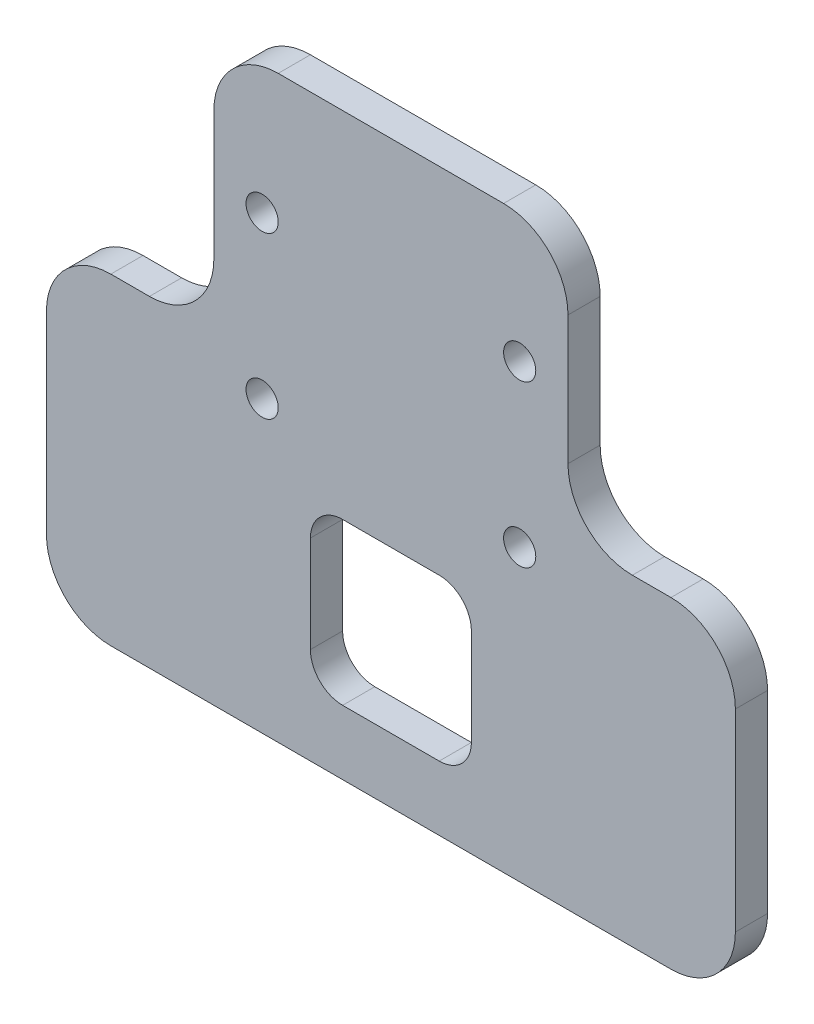
ISO-10303-21;
HEADER;
FILE_DESCRIPTION(('STEP AP214'),'2;1');
FILE_NAME('part.step','',(''),(''),'','','');
FILE_SCHEMA(('AUTOMOTIVE_DESIGN { 1 0 10303 214 1 1 1 1 }'));
ENDSEC;
DATA;
#1=APPLICATION_CONTEXT('core data for automotive mechanical design processes');
#2=APPLICATION_PROTOCOL_DEFINITION('international standard','automotive_design',2000,#1);
#3=PRODUCT_CONTEXT('',#1,'mechanical');
#4=PRODUCT('Part','Part','',(#3));
#5=PRODUCT_RELATED_PRODUCT_CATEGORY('part','',(#4));
#6=PRODUCT_DEFINITION_FORMATION('','',#4);
#7=PRODUCT_DEFINITION_CONTEXT('part definition',#1,'design');
#8=PRODUCT_DEFINITION('design','',#6,#7);
#9=PRODUCT_DEFINITION_SHAPE('','',#8);
#10=(LENGTH_UNIT() NAMED_UNIT(*) SI_UNIT(.MILLI.,.METRE.));
#11=(NAMED_UNIT(*) PLANE_ANGLE_UNIT() SI_UNIT($,.RADIAN.));
#12=(NAMED_UNIT(*) SI_UNIT($,.STERADIAN.) SOLID_ANGLE_UNIT());
#13=UNCERTAINTY_MEASURE_WITH_UNIT(LENGTH_MEASURE(1.E-05),#10,'distance_accuracy_value','');
#14=(GEOMETRIC_REPRESENTATION_CONTEXT(3) GLOBAL_UNCERTAINTY_ASSIGNED_CONTEXT((#13)) GLOBAL_UNIT_ASSIGNED_CONTEXT((#10,
#11,#12)) REPRESENTATION_CONTEXT('',''));
#15=CARTESIAN_POINT('',(0.,0.,0.));
#16=DIRECTION('',(0.,0.,1.));
#17=DIRECTION('',(1.,0.,0.));
#18=AXIS2_PLACEMENT_3D('',#15,#16,#17);
#19=CARTESIAN_POINT('',(20.,45.,5.));
#20=DIRECTION('',(0.,0.,-1.));
#21=DIRECTION('',(-1.,0.,0.));
#22=AXIS2_PLACEMENT_3D('',#19,#20,#21);
#23=CYLINDRICAL_SURFACE('',#22,2.5);
#24=CARTESIAN_POINT('',(20.,45.,5.));
#25=DIRECTION('',(0.,0.,1.));
#26=DIRECTION('',(1.,0.,0.));
#27=AXIS2_PLACEMENT_3D('',#24,#25,#26);
#28=CIRCLE('',#27,2.5);
#29=CARTESIAN_POINT('',(22.5,45.,5.));
#30=VERTEX_POINT('',#29);
#31=EDGE_CURVE('E345',#30,#30,#28,.F.);
#32=ORIENTED_EDGE('',*,*,#31,.F.);
#33=EDGE_LOOP('',(#32));
#34=FACE_BOUND('',#33,.T.);
#35=CARTESIAN_POINT('',(20.,45.,0.));
#36=DIRECTION('',(0.,0.,1.));
#37=DIRECTION('',(1.,0.,0.));
#38=AXIS2_PLACEMENT_3D('',#35,#36,#37);
#39=CIRCLE('',#38,2.5);
#40=CARTESIAN_POINT('',(22.5,45.,0.));
#41=VERTEX_POINT('',#40);
#42=EDGE_CURVE('E339',#41,#41,#39,.F.);
#43=ORIENTED_EDGE('',*,*,#42,.T.);
#44=EDGE_LOOP('',(#43));
#45=FACE_BOUND('',#44,.T.);
#46=ADVANCED_FACE('F95',(#34,#45),#23,.F.);
#47=CARTESIAN_POINT('',(0.,-15.,5.));
#48=DIRECTION('',(0.,1.,0.));
#49=DIRECTION('',(0.,0.,1.));
#50=AXIS2_PLACEMENT_3D('',#47,#48,#49);
#51=PLANE('',#50);
#52=DIRECTION('',(1.,0.,0.));
#53=VECTOR('',#52,1.);
#54=CARTESIAN_POINT('',(0.,-15.,0.));
#55=LINE('',#54,#53);
#56=CARTESIAN_POINT('',(-7.5,-15.,0.));
#57=VERTEX_POINT('',#56);
#58=CARTESIAN_POINT('',(7.5,-15.,0.));
#59=VERTEX_POINT('',#58);
#60=EDGE_CURVE('E327',#57,#59,#55,.T.);
#61=ORIENTED_EDGE('',*,*,#60,.F.);
#62=DIRECTION('',(0.,0.,-1.));
#63=VECTOR('',#62,1.);
#64=CARTESIAN_POINT('',(-7.5,-15.,5.));
#65=LINE('',#64,#63);
#66=CARTESIAN_POINT('',(-7.5,-15.,5.));
#67=VERTEX_POINT('',#66);
#68=EDGE_CURVE('E454',#57,#67,#65,.F.);
#69=ORIENTED_EDGE('',*,*,#68,.T.);
#70=DIRECTION('',(1.,0.,0.));
#71=VECTOR('',#70,1.);
#72=CARTESIAN_POINT('',(0.,-15.,5.));
#73=LINE('',#72,#71);
#74=CARTESIAN_POINT('',(7.5,-15.,5.));
#75=VERTEX_POINT('',#74);
#76=EDGE_CURVE('E494',#67,#75,#73,.T.);
#77=ORIENTED_EDGE('',*,*,#76,.T.);
#78=DIRECTION('',(0.,0.,-1.));
#79=VECTOR('',#78,1.);
#80=CARTESIAN_POINT('',(7.5,-15.,0.));
#81=LINE('',#80,#79);
#82=EDGE_CURVE('E450',#75,#59,#81,.T.);
#83=ORIENTED_EDGE('',*,*,#82,.T.);
#84=EDGE_LOOP('',(#61,#69,#77,#83));
#85=FACE_BOUND('',#84,.T.);
#86=ADVANCED_FACE('F541',(#85),#51,.T.);
#87=CARTESIAN_POINT('',(-12.5,0.,5.));
#88=DIRECTION('',(-1.,0.,0.));
#89=DIRECTION('',(0.,0.,1.));
#90=AXIS2_PLACEMENT_3D('',#87,#88,#89);
#91=PLANE('',#90);
#92=DIRECTION('',(0.,1.,0.));
#93=VECTOR('',#92,1.);
#94=CARTESIAN_POINT('',(-12.5,0.,0.));
#95=LINE('',#94,#93);
#96=CARTESIAN_POINT('',(-12.5,-9.99999999999997,0.));
#97=VERTEX_POINT('',#96);
#98=CARTESIAN_POINT('',(-12.5,5.00000000000003,0.));
#99=VERTEX_POINT('',#98);
#100=EDGE_CURVE('E331',#97,#99,#95,.T.);
#101=ORIENTED_EDGE('',*,*,#100,.T.);
#102=DIRECTION('',(0.,0.,-1.));
#103=VECTOR('',#102,1.);
#104=CARTESIAN_POINT('',(-12.5,5.00000000000003,5.));
#105=LINE('',#104,#103);
#106=CARTESIAN_POINT('',(-12.5,5.00000000000003,5.));
#107=VERTEX_POINT('',#106);
#108=EDGE_CURVE('E447',#99,#107,#105,.F.);
#109=ORIENTED_EDGE('',*,*,#108,.T.);
#110=DIRECTION('',(0.,1.,0.));
#111=VECTOR('',#110,1.);
#112=CARTESIAN_POINT('',(-12.5,0.,5.));
#113=LINE('',#112,#111);
#114=CARTESIAN_POINT('',(-12.5,-9.99999999999997,5.));
#115=VERTEX_POINT('',#114);
#116=EDGE_CURVE('E500',#115,#107,#113,.T.);
#117=ORIENTED_EDGE('',*,*,#116,.F.);
#118=DIRECTION('',(0.,0.,-1.));
#119=VECTOR('',#118,1.);
#120=CARTESIAN_POINT('',(-12.5,-9.99999999999997,5.));
#121=LINE('',#120,#119);
#122=EDGE_CURVE('E443',#115,#97,#121,.T.);
#123=ORIENTED_EDGE('',*,*,#122,.T.);
#124=EDGE_LOOP('',(#101,#109,#117,#123));
#125=FACE_BOUND('',#124,.T.);
#126=ADVANCED_FACE('F547',(#125),#91,.F.);
#127=CARTESIAN_POINT('',(0.,10.,5.));
#128=DIRECTION('',(0.,1.,0.));
#129=DIRECTION('',(0.,0.,1.));
#130=AXIS2_PLACEMENT_3D('',#127,#128,#129);
#131=PLANE('',#130);
#132=DIRECTION('',(1.,0.,0.));
#133=VECTOR('',#132,1.);
#134=CARTESIAN_POINT('',(0.,10.,5.));
#135=LINE('',#134,#133);
#136=CARTESIAN_POINT('',(-7.5,10.,5.));
#137=VERTEX_POINT('',#136);
#138=CARTESIAN_POINT('',(7.5,10.,5.));
#139=VERTEX_POINT('',#138);
#140=EDGE_CURVE('E510',#137,#139,#135,.T.);
#141=ORIENTED_EDGE('',*,*,#140,.F.);
#142=DIRECTION('',(0.,0.,-1.));
#143=VECTOR('',#142,1.);
#144=CARTESIAN_POINT('',(-7.5,10.,0.));
#145=LINE('',#144,#143);
#146=CARTESIAN_POINT('',(-7.5,10.,0.));
#147=VERTEX_POINT('',#146);
#148=EDGE_CURVE('E439',#137,#147,#145,.T.);
#149=ORIENTED_EDGE('',*,*,#148,.T.);
#150=DIRECTION('',(1.,0.,0.));
#151=VECTOR('',#150,1.);
#152=CARTESIAN_POINT('',(0.,10.,0.));
#153=LINE('',#152,#151);
#154=CARTESIAN_POINT('',(7.5,10.,0.));
#155=VERTEX_POINT('',#154);
#156=EDGE_CURVE('E335',#147,#155,#153,.T.);
#157=ORIENTED_EDGE('',*,*,#156,.T.);
#158=DIRECTION('',(0.,0.,-1.));
#159=VECTOR('',#158,1.);
#160=CARTESIAN_POINT('',(7.5,10.,5.));
#161=LINE('',#160,#159);
#162=EDGE_CURVE('E436',#155,#139,#161,.F.);
#163=ORIENTED_EDGE('',*,*,#162,.T.);
#164=EDGE_LOOP('',(#141,#149,#157,#163));
#165=FACE_BOUND('',#164,.T.);
#166=ADVANCED_FACE('F488',(#165),#131,.F.);
#167=CARTESIAN_POINT('',(12.5,0.,5.));
#168=DIRECTION('',(-1.,0.,0.));
#169=DIRECTION('',(0.,0.,1.));
#170=AXIS2_PLACEMENT_3D('',#167,#168,#169);
#171=PLANE('',#170);
#172=DIRECTION('',(0.,1.,0.));
#173=VECTOR('',#172,1.);
#174=CARTESIAN_POINT('',(12.5,0.,0.));
#175=LINE('',#174,#173);
#176=CARTESIAN_POINT('',(12.5,-9.99999999999997,0.));
#177=VERTEX_POINT('',#176);
#178=CARTESIAN_POINT('',(12.5,5.00000000000003,0.));
#179=VERTEX_POINT('',#178);
#180=EDGE_CURVE('E323',#177,#179,#175,.T.);
#181=ORIENTED_EDGE('',*,*,#180,.F.);
#182=DIRECTION('',(0.,0.,-1.));
#183=VECTOR('',#182,1.);
#184=CARTESIAN_POINT('',(12.5,-9.99999999999997,5.));
#185=LINE('',#184,#183);
#186=CARTESIAN_POINT('',(12.5,-9.99999999999997,5.));
#187=VERTEX_POINT('',#186);
#188=EDGE_CURVE('E116',#177,#187,#185,.F.);
#189=ORIENTED_EDGE('',*,*,#188,.T.);
#190=DIRECTION('',(0.,1.,0.));
#191=VECTOR('',#190,1.);
#192=CARTESIAN_POINT('',(12.5,0.,5.));
#193=LINE('',#192,#191);
#194=CARTESIAN_POINT('',(12.5,5.00000000000003,5.));
#195=VERTEX_POINT('',#194);
#196=EDGE_CURVE('E491',#187,#195,#193,.T.);
#197=ORIENTED_EDGE('',*,*,#196,.T.);
#198=DIRECTION('',(0.,0.,-1.));
#199=VECTOR('',#198,1.);
#200=CARTESIAN_POINT('',(12.5,5.00000000000003,5.));
#201=LINE('',#200,#199);
#202=EDGE_CURVE('E457',#195,#179,#201,.T.);
#203=ORIENTED_EDGE('',*,*,#202,.T.);
#204=EDGE_LOOP('',(#181,#189,#197,#203));
#205=FACE_BOUND('',#204,.T.);
#206=ADVANCED_FACE('F490',(#205),#171,.T.);
#207=CARTESIAN_POINT('',(0.,25.,5.));
#208=DIRECTION('',(0.,-1.,0.));
#209=DIRECTION('',(1.,0.,0.));
#210=AXIS2_PLACEMENT_3D('',#207,#208,#209);
#211=PLANE('',#210);
#212=DIRECTION('',(-1.,0.,0.));
#213=VECTOR('',#212,1.);
#214=CARTESIAN_POINT('',(0.,25.,0.));
#215=LINE('',#214,#213);
#216=CARTESIAN_POINT('',(-37.5,25.,0.));
#217=VERTEX_POINT('',#216);
#218=CARTESIAN_POINT('',(-43.5,25.,0.));
#219=VERTEX_POINT('',#218);
#220=EDGE_CURVE('E288',#217,#219,#215,.T.);
#221=ORIENTED_EDGE('',*,*,#220,.T.);
#222=DIRECTION('',(0.,0.,-1.));
#223=VECTOR('',#222,1.);
#224=CARTESIAN_POINT('',(-43.5,25.,5.));
#225=LINE('',#224,#223);
#226=CARTESIAN_POINT('',(-43.5,25.,5.));
#227=VERTEX_POINT('',#226);
#228=EDGE_CURVE('E422',#219,#227,#225,.F.);
#229=ORIENTED_EDGE('',*,*,#228,.T.);
#230=DIRECTION('',(-1.,0.,0.));
#231=VECTOR('',#230,1.);
#232=CARTESIAN_POINT('',(0.,25.,5.));
#233=LINE('',#232,#231);
#234=CARTESIAN_POINT('',(-37.5,25.,5.));
#235=VERTEX_POINT('',#234);
#236=EDGE_CURVE('E882',#235,#227,#233,.T.);
#237=ORIENTED_EDGE('',*,*,#236,.F.);
#238=DIRECTION('',(0.,0.,-1.));
#239=VECTOR('',#238,1.);
#240=CARTESIAN_POINT('',(-37.5,25.,0.));
#241=LINE('',#240,#239);
#242=EDGE_CURVE('E418',#235,#217,#241,.T.);
#243=ORIENTED_EDGE('',*,*,#242,.T.);
#244=EDGE_LOOP('',(#221,#229,#237,#243));
#245=FACE_BOUND('',#244,.T.);
#246=ADVANCED_FACE('F562',(#245),#211,.F.);
#247=CARTESIAN_POINT('',(-53.5,0.,5.));
#248=DIRECTION('',(-1.,0.,0.));
#249=DIRECTION('',(0.,-1.,0.));
#250=AXIS2_PLACEMENT_3D('',#247,#248,#249);
#251=PLANE('',#250);
#252=DIRECTION('',(0.,1.,0.));
#253=VECTOR('',#252,1.);
#254=CARTESIAN_POINT('',(-53.5,0.,5.));
#255=LINE('',#254,#253);
#256=CARTESIAN_POINT('',(-53.5,-15.,5.));
#257=VERTEX_POINT('',#256);
#258=CARTESIAN_POINT('',(-53.5,15.,5.));
#259=VERTEX_POINT('',#258);
#260=EDGE_CURVE('E876',#257,#259,#255,.T.);
#261=ORIENTED_EDGE('',*,*,#260,.T.);
#262=DIRECTION('',(0.,0.,-1.));
#263=VECTOR('',#262,1.);
#264=CARTESIAN_POINT('',(-53.5,15.,0.));
#265=LINE('',#264,#263);
#266=CARTESIAN_POINT('',(-53.5,15.,0.));
#267=VERTEX_POINT('',#266);
#268=EDGE_CURVE('E414',#259,#267,#265,.T.);
#269=ORIENTED_EDGE('',*,*,#268,.T.);
#270=DIRECTION('',(0.,1.,0.));
#271=VECTOR('',#270,1.);
#272=CARTESIAN_POINT('',(-53.5,0.,0.));
#273=LINE('',#272,#271);
#274=CARTESIAN_POINT('',(-53.5,-15.,0.));
#275=VERTEX_POINT('',#274);
#276=EDGE_CURVE('E294',#275,#267,#273,.T.);
#277=ORIENTED_EDGE('',*,*,#276,.F.);
#278=DIRECTION('',(0.,0.,-1.));
#279=VECTOR('',#278,1.);
#280=CARTESIAN_POINT('',(-53.5,-15.,5.));
#281=LINE('',#280,#279);
#282=EDGE_CURVE('E411',#275,#257,#281,.F.);
#283=ORIENTED_EDGE('',*,*,#282,.T.);
#284=EDGE_LOOP('',(#261,#269,#277,#283));
#285=FACE_BOUND('',#284,.T.);
#286=ADVANCED_FACE('F582',(#285),#251,.T.);
#287=CARTESIAN_POINT('',(0.,-25.,5.));
#288=DIRECTION('',(0.,1.,0.));
#289=DIRECTION('',(-1.,0.,0.));
#290=AXIS2_PLACEMENT_3D('',#287,#288,#289);
#291=PLANE('',#290);
#292=DIRECTION('',(1.,0.,0.));
#293=VECTOR('',#292,1.);
#294=CARTESIAN_POINT('',(0.,-25.,0.));
#295=LINE('',#294,#293);
#296=CARTESIAN_POINT('',(-43.5,-25.,0.));
#297=VERTEX_POINT('',#296);
#298=CARTESIAN_POINT('',(43.5,-25.,0.));
#299=VERTEX_POINT('',#298);
#300=EDGE_CURVE('E304',#297,#299,#295,.T.);
#301=ORIENTED_EDGE('',*,*,#300,.T.);
#302=DIRECTION('',(0.,0.,-1.));
#303=VECTOR('',#302,1.);
#304=CARTESIAN_POINT('',(43.5,-25.,5.));
#305=LINE('',#304,#303);
#306=CARTESIAN_POINT('',(43.5,-25.,5.));
#307=VERTEX_POINT('',#306);
#308=EDGE_CURVE('E408',#299,#307,#305,.F.);
#309=ORIENTED_EDGE('',*,*,#308,.T.);
#310=DIRECTION('',(1.,0.,0.));
#311=VECTOR('',#310,1.);
#312=CARTESIAN_POINT('',(0.,-25.,5.));
#313=LINE('',#312,#311);
#314=CARTESIAN_POINT('',(-43.5,-25.,5.));
#315=VERTEX_POINT('',#314);
#316=EDGE_CURVE('E869',#315,#307,#313,.T.);
#317=ORIENTED_EDGE('',*,*,#316,.F.);
#318=DIRECTION('',(0.,0.,-1.));
#319=VECTOR('',#318,1.);
#320=CARTESIAN_POINT('',(-43.5,-25.,0.));
#321=LINE('',#320,#319);
#322=EDGE_CURVE('E404',#315,#297,#321,.T.);
#323=ORIENTED_EDGE('',*,*,#322,.T.);
#324=EDGE_LOOP('',(#301,#309,#317,#323));
#325=FACE_BOUND('',#324,.T.);
#326=ADVANCED_FACE('F578',(#325),#291,.F.);
#327=CARTESIAN_POINT('',(53.5,0.,5.));
#328=DIRECTION('',(-1.,0.,0.));
#329=DIRECTION('',(0.,-1.,0.));
#330=AXIS2_PLACEMENT_3D('',#327,#328,#329);
#331=PLANE('',#330);
#332=DIRECTION('',(0.,1.,0.));
#333=VECTOR('',#332,1.);
#334=CARTESIAN_POINT('',(53.5,0.,0.));
#335=LINE('',#334,#333);
#336=CARTESIAN_POINT('',(53.5,-15.,0.));
#337=VERTEX_POINT('',#336);
#338=CARTESIAN_POINT('',(53.5,15.,0.));
#339=VERTEX_POINT('',#338);
#340=EDGE_CURVE('E308',#337,#339,#335,.T.);
#341=ORIENTED_EDGE('',*,*,#340,.T.);
#342=DIRECTION('',(0.,0.,-1.));
#343=VECTOR('',#342,1.);
#344=CARTESIAN_POINT('',(53.5,15.,5.));
#345=LINE('',#344,#343);
#346=CARTESIAN_POINT('',(53.5,15.,5.));
#347=VERTEX_POINT('',#346);
#348=EDGE_CURVE('E401',#339,#347,#345,.F.);
#349=ORIENTED_EDGE('',*,*,#348,.T.);
#350=DIRECTION('',(0.,1.,0.));
#351=VECTOR('',#350,1.);
#352=CARTESIAN_POINT('',(53.5,0.,5.));
#353=LINE('',#352,#351);
#354=CARTESIAN_POINT('',(53.5,-15.,5.));
#355=VERTEX_POINT('',#354);
#356=EDGE_CURVE('E862',#355,#347,#353,.T.);
#357=ORIENTED_EDGE('',*,*,#356,.F.);
#358=DIRECTION('',(0.,0.,-1.));
#359=VECTOR('',#358,1.);
#360=CARTESIAN_POINT('',(53.5,-15.,5.));
#361=LINE('',#360,#359);
#362=EDGE_CURVE('E397',#355,#337,#361,.T.);
#363=ORIENTED_EDGE('',*,*,#362,.T.);
#364=EDGE_LOOP('',(#341,#349,#357,#363));
#365=FACE_BOUND('',#364,.T.);
#366=ADVANCED_FACE('F574',(#365),#331,.F.);
#367=CARTESIAN_POINT('',(0.,25.0000000000001,5.));
#368=DIRECTION('',(0.,-1.,0.));
#369=DIRECTION('',(1.,0.,0.));
#370=AXIS2_PLACEMENT_3D('',#367,#368,#369);
#371=PLANE('',#370);
#372=DIRECTION('',(-1.,0.,0.));
#373=VECTOR('',#372,1.);
#374=CARTESIAN_POINT('',(0.,25.0000000000001,0.));
#375=LINE('',#374,#373);
#376=CARTESIAN_POINT('',(43.5,25.,0.));
#377=VERTEX_POINT('',#376);
#378=CARTESIAN_POINT('',(37.5,25.,0.));
#379=VERTEX_POINT('',#378);
#380=EDGE_CURVE('E312',#377,#379,#375,.T.);
#381=ORIENTED_EDGE('',*,*,#380,.T.);
#382=DIRECTION('',(0.,0.,-1.));
#383=VECTOR('',#382,1.);
#384=CARTESIAN_POINT('',(37.5,25.,5.));
#385=LINE('',#384,#383);
#386=CARTESIAN_POINT('',(37.5,25.,5.));
#387=VERTEX_POINT('',#386);
#388=EDGE_CURVE('E394',#379,#387,#385,.F.);
#389=ORIENTED_EDGE('',*,*,#388,.T.);
#390=DIRECTION('',(-1.,0.,0.));
#391=VECTOR('',#390,1.);
#392=CARTESIAN_POINT('',(0.,25.0000000000001,5.));
#393=LINE('',#392,#391);
#394=CARTESIAN_POINT('',(43.5,25.,5.));
#395=VERTEX_POINT('',#394);
#396=EDGE_CURVE('E855',#395,#387,#393,.T.);
#397=ORIENTED_EDGE('',*,*,#396,.F.);
#398=DIRECTION('',(0.,0.,-1.));
#399=VECTOR('',#398,1.);
#400=CARTESIAN_POINT('',(43.5,25.,5.));
#401=LINE('',#400,#399);
#402=EDGE_CURVE('E390',#395,#377,#401,.T.);
#403=ORIENTED_EDGE('',*,*,#402,.T.);
#404=EDGE_LOOP('',(#381,#389,#397,#403));
#405=FACE_BOUND('',#404,.T.);
#406=ADVANCED_FACE('F570',(#405),#371,.F.);
#407=CARTESIAN_POINT('',(27.5,0.,5.));
#408=DIRECTION('',(1.,0.,0.));
#409=DIRECTION('',(0.,1.,0.));
#410=AXIS2_PLACEMENT_3D('',#407,#408,#409);
#411=PLANE('',#410);
#412=DIRECTION('',(0.,-1.,0.));
#413=VECTOR('',#412,1.);
#414=CARTESIAN_POINT('',(27.5,0.,0.));
#415=LINE('',#414,#413);
#416=CARTESIAN_POINT('',(27.5,55.,0.));
#417=VERTEX_POINT('',#416);
#418=CARTESIAN_POINT('',(27.5,35.,0.));
#419=VERTEX_POINT('',#418);
#420=EDGE_CURVE('E316',#417,#419,#415,.T.);
#421=ORIENTED_EDGE('',*,*,#420,.F.);
#422=DIRECTION('',(0.,0.,-1.));
#423=VECTOR('',#422,1.);
#424=CARTESIAN_POINT('',(27.5,55.,5.));
#425=LINE('',#424,#423);
#426=CARTESIAN_POINT('',(27.5,55.,5.));
#427=VERTEX_POINT('',#426);
#428=EDGE_CURVE('E387',#417,#427,#425,.F.);
#429=ORIENTED_EDGE('',*,*,#428,.T.);
#430=DIRECTION('',(0.,-1.,0.));
#431=VECTOR('',#430,1.);
#432=CARTESIAN_POINT('',(27.5,0.,5.));
#433=LINE('',#432,#431);
#434=CARTESIAN_POINT('',(27.5,35.,5.));
#435=VERTEX_POINT('',#434);
#436=EDGE_CURVE('E503',#427,#435,#433,.T.);
#437=ORIENTED_EDGE('',*,*,#436,.T.);
#438=DIRECTION('',(0.,0.,-1.));
#439=VECTOR('',#438,1.);
#440=CARTESIAN_POINT('',(27.5,35.,5.));
#441=LINE('',#440,#439);
#442=EDGE_CURVE('E383',#435,#419,#441,.T.);
#443=ORIENTED_EDGE('',*,*,#442,.T.);
#444=EDGE_LOOP('',(#421,#429,#437,#443));
#445=FACE_BOUND('',#444,.T.);
#446=ADVANCED_FACE('F566',(#445),#411,.T.);
#447=CARTESIAN_POINT('',(0.,65.,5.));
#448=DIRECTION('',(0.,1.,0.));
#449=DIRECTION('',(0.,0.,1.));
#450=AXIS2_PLACEMENT_3D('',#447,#448,#449);
#451=PLANE('',#450);
#452=DIRECTION('',(1.,0.,0.));
#453=VECTOR('',#452,1.);
#454=CARTESIAN_POINT('',(0.,65.,0.));
#455=LINE('',#454,#453);
#456=CARTESIAN_POINT('',(-17.5,65.,0.));
#457=VERTEX_POINT('',#456);
#458=CARTESIAN_POINT('',(17.5,65.,0.));
#459=VERTEX_POINT('',#458);
#460=EDGE_CURVE('E320',#457,#459,#455,.T.);
#461=ORIENTED_EDGE('',*,*,#460,.F.);
#462=DIRECTION('',(0.,0.,-1.));
#463=VECTOR('',#462,1.);
#464=CARTESIAN_POINT('',(-17.5,65.,5.));
#465=LINE('',#464,#463);
#466=CARTESIAN_POINT('',(-17.5,65.,5.));
#467=VERTEX_POINT('',#466);
#468=EDGE_CURVE('E262',#457,#467,#465,.F.);
#469=ORIENTED_EDGE('',*,*,#468,.T.);
#470=DIRECTION('',(1.,0.,0.));
#471=VECTOR('',#470,1.);
#472=CARTESIAN_POINT('',(0.,65.,5.));
#473=LINE('',#472,#471);
#474=CARTESIAN_POINT('',(17.5,65.,5.));
#475=VERTEX_POINT('',#474);
#476=EDGE_CURVE('E495',#467,#475,#473,.T.);
#477=ORIENTED_EDGE('',*,*,#476,.T.);
#478=DIRECTION('',(0.,0.,-1.));
#479=VECTOR('',#478,1.);
#480=CARTESIAN_POINT('',(17.5,65.,5.));
#481=LINE('',#480,#479);
#482=EDGE_CURVE('E268',#475,#459,#481,.T.);
#483=ORIENTED_EDGE('',*,*,#482,.T.);
#484=EDGE_LOOP('',(#461,#469,#477,#483));
#485=FACE_BOUND('',#484,.T.);
#486=ADVANCED_FACE('F563',(#485),#451,.T.);
#487=CARTESIAN_POINT('',(-27.5,0.,5.));
#488=DIRECTION('',(1.,0.,0.));
#489=DIRECTION('',(0.,1.,0.));
#490=AXIS2_PLACEMENT_3D('',#487,#488,#489);
#491=PLANE('',#490);
#492=DIRECTION('',(0.,-1.,0.));
#493=VECTOR('',#492,1.);
#494=CARTESIAN_POINT('',(-27.5,0.,5.));
#495=LINE('',#494,#493);
#496=CARTESIAN_POINT('',(-27.5,55.,5.));
#497=VERTEX_POINT('',#496);
#498=CARTESIAN_POINT('',(-27.5,35.,5.));
#499=VERTEX_POINT('',#498);
#500=EDGE_CURVE('E278',#497,#499,#495,.T.);
#501=ORIENTED_EDGE('',*,*,#500,.F.);
#502=DIRECTION('',(0.,0.,-1.));
#503=VECTOR('',#502,1.);
#504=CARTESIAN_POINT('',(-27.5,55.,0.));
#505=LINE('',#504,#503);
#506=CARTESIAN_POINT('',(-27.5,55.,0.));
#507=VERTEX_POINT('',#506);
#508=EDGE_CURVE('E261',#497,#507,#505,.T.);
#509=ORIENTED_EDGE('',*,*,#508,.T.);
#510=DIRECTION('',(0.,-1.,0.));
#511=VECTOR('',#510,1.);
#512=CARTESIAN_POINT('',(-27.5,0.,0.));
#513=LINE('',#512,#511);
#514=CARTESIAN_POINT('',(-27.5,35.,0.));
#515=VERTEX_POINT('',#514);
#516=EDGE_CURVE('E275',#507,#515,#513,.T.);
#517=ORIENTED_EDGE('',*,*,#516,.T.);
#518=DIRECTION('',(0.,0.,-1.));
#519=VECTOR('',#518,1.);
#520=CARTESIAN_POINT('',(-27.5,35.,5.));
#521=LINE('',#520,#519);
#522=EDGE_CURVE('E281',#515,#499,#521,.F.);
#523=ORIENTED_EDGE('',*,*,#522,.T.);
#524=EDGE_LOOP('',(#501,#509,#517,#523));
#525=FACE_BOUND('',#524,.T.);
#526=ADVANCED_FACE('F274',(#525),#491,.F.);
#527=CARTESIAN_POINT('',(-20.,45.,5.));
#528=DIRECTION('',(0.,0.,-1.));
#529=DIRECTION('',(-1.,0.,0.));
#530=AXIS2_PLACEMENT_3D('',#527,#528,#529);
#531=CYLINDRICAL_SURFACE('',#530,2.5);
#532=CARTESIAN_POINT('',(-20.,45.,5.));
#533=DIRECTION('',(0.,0.,1.));
#534=DIRECTION('',(1.,0.,0.));
#535=AXIS2_PLACEMENT_3D('',#532,#533,#534);
#536=CIRCLE('',#535,2.5);
#537=CARTESIAN_POINT('',(-17.5,45.,5.));
#538=VERTEX_POINT('',#537);
#539=EDGE_CURVE('E840',#538,#538,#536,.T.);
#540=ORIENTED_EDGE('',*,*,#539,.T.);
#541=EDGE_LOOP('',(#540));
#542=FACE_BOUND('',#541,.T.);
#543=CARTESIAN_POINT('',(-20.,45.,0.));
#544=DIRECTION('',(0.,0.,1.));
#545=DIRECTION('',(1.,0.,0.));
#546=AXIS2_PLACEMENT_3D('',#543,#544,#545);
#547=CIRCLE('',#546,2.5);
#548=CARTESIAN_POINT('',(-17.5,45.,0.));
#549=VERTEX_POINT('',#548);
#550=EDGE_CURVE('E289',#549,#549,#547,.T.);
#551=ORIENTED_EDGE('',*,*,#550,.F.);
#552=EDGE_LOOP('',(#551));
#553=FACE_BOUND('',#552,.T.);
#554=ADVANCED_FACE('F528',(#542,#553),#531,.F.);
#555=CARTESIAN_POINT('',(-20.,20.,5.));
#556=DIRECTION('',(0.,0.,-1.));
#557=DIRECTION('',(-1.,0.,0.));
#558=AXIS2_PLACEMENT_3D('',#555,#556,#557);
#559=CYLINDRICAL_SURFACE('',#558,2.5);
#560=CARTESIAN_POINT('',(-20.,20.,5.));
#561=DIRECTION('',(0.,0.,1.));
#562=DIRECTION('',(1.,0.,0.));
#563=AXIS2_PLACEMENT_3D('',#560,#561,#562);
#564=CIRCLE('',#563,2.5);
#565=CARTESIAN_POINT('',(-17.5,20.,5.));
#566=VERTEX_POINT('',#565);
#567=EDGE_CURVE('E836',#566,#566,#564,.T.);
#568=ORIENTED_EDGE('',*,*,#567,.T.);
#569=EDGE_LOOP('',(#568));
#570=FACE_BOUND('',#569,.T.);
#571=CARTESIAN_POINT('',(-20.,20.,0.));
#572=DIRECTION('',(0.,0.,1.));
#573=DIRECTION('',(1.,0.,0.));
#574=AXIS2_PLACEMENT_3D('',#571,#572,#573);
#575=CIRCLE('',#574,2.5);
#576=CARTESIAN_POINT('',(-17.5,20.,0.));
#577=VERTEX_POINT('',#576);
#578=EDGE_CURVE('E297',#577,#577,#575,.T.);
#579=ORIENTED_EDGE('',*,*,#578,.F.);
#580=EDGE_LOOP('',(#579));
#581=FACE_BOUND('',#580,.T.);
#582=ADVANCED_FACE('F525',(#570,#581),#559,.F.);
#583=CARTESIAN_POINT('',(20.,20.,5.));
#584=DIRECTION('',(0.,0.,-1.));
#585=DIRECTION('',(-1.,0.,0.));
#586=AXIS2_PLACEMENT_3D('',#583,#584,#585);
#587=CYLINDRICAL_SURFACE('',#586,2.5);
#588=CARTESIAN_POINT('',(20.,20.,5.));
#589=DIRECTION('',(0.,0.,1.));
#590=DIRECTION('',(1.,0.,0.));
#591=AXIS2_PLACEMENT_3D('',#588,#589,#590);
#592=CIRCLE('',#591,2.5);
#593=CARTESIAN_POINT('',(22.5,20.,5.));
#594=VERTEX_POINT('',#593);
#595=EDGE_CURVE('E343',#594,#594,#592,.F.);
#596=ORIENTED_EDGE('',*,*,#595,.F.);
#597=EDGE_LOOP('',(#596));
#598=FACE_BOUND('',#597,.T.);
#599=CARTESIAN_POINT('',(20.,20.,0.));
#600=DIRECTION('',(0.,0.,1.));
#601=DIRECTION('',(1.,0.,0.));
#602=AXIS2_PLACEMENT_3D('',#599,#600,#601);
#603=CIRCLE('',#602,2.5);
#604=CARTESIAN_POINT('',(22.5,20.,0.));
#605=VERTEX_POINT('',#604);
#606=EDGE_CURVE('E516',#605,#605,#603,.F.);
#607=ORIENTED_EDGE('',*,*,#606,.T.);
#608=EDGE_LOOP('',(#607));
#609=FACE_BOUND('',#608,.T.);
#610=ADVANCED_FACE('F527',(#598,#609),#587,.F.);
#611=CARTESIAN_POINT('',(0.,0.,0.));
#612=DIRECTION('',(0.,0.,1.));
#613=DIRECTION('',(1.,0.,0.));
#614=AXIS2_PLACEMENT_3D('',#611,#612,#613);
#615=PLANE('',#614);
#616=ORIENTED_EDGE('',*,*,#606,.F.);
#617=EDGE_LOOP('',(#616));
#618=FACE_BOUND('',#617,.T.);
#619=ORIENTED_EDGE('',*,*,#578,.T.);
#620=EDGE_LOOP('',(#619));
#621=FACE_BOUND('',#620,.T.);
#622=ORIENTED_EDGE('',*,*,#550,.T.);
#623=EDGE_LOOP('',(#622));
#624=FACE_BOUND('',#623,.T.);
#625=ORIENTED_EDGE('',*,*,#516,.F.);
#626=CARTESIAN_POINT('',(-17.5,55.,0.));
#627=DIRECTION('',(0.,0.,1.));
#628=DIRECTION('',(1.,0.,0.));
#629=AXIS2_PLACEMENT_3D('',#626,#627,#628);
#630=CIRCLE('',#629,10.);
#631=EDGE_CURVE('E257',#507,#457,#630,.F.);
#632=ORIENTED_EDGE('',*,*,#631,.T.);
#633=ORIENTED_EDGE('',*,*,#460,.T.);
#634=CARTESIAN_POINT('',(17.5,55.,0.));
#635=DIRECTION('',(0.,0.,1.));
#636=DIRECTION('',(1.,0.,0.));
#637=AXIS2_PLACEMENT_3D('',#634,#635,#636);
#638=CIRCLE('',#637,10.);
#639=EDGE_CURVE('E269',#459,#417,#638,.F.);
#640=ORIENTED_EDGE('',*,*,#639,.T.);
#641=ORIENTED_EDGE('',*,*,#420,.T.);
#642=CARTESIAN_POINT('',(37.5,35.,0.));
#643=DIRECTION('',(0.,0.,1.));
#644=DIRECTION('',(1.,0.,0.));
#645=AXIS2_PLACEMENT_3D('',#642,#643,#644);
#646=CIRCLE('',#645,10.);
#647=EDGE_CURVE('E425',#419,#379,#646,.T.);
#648=ORIENTED_EDGE('',*,*,#647,.T.);
#649=ORIENTED_EDGE('',*,*,#380,.F.);
#650=CARTESIAN_POINT('',(43.5,15.,0.));
#651=DIRECTION('',(0.,0.,1.));
#652=DIRECTION('',(1.,0.,0.));
#653=AXIS2_PLACEMENT_3D('',#650,#651,#652);
#654=CIRCLE('',#653,10.);
#655=EDGE_CURVE('E355',#377,#339,#654,.F.);
#656=ORIENTED_EDGE('',*,*,#655,.T.);
#657=ORIENTED_EDGE('',*,*,#340,.F.);
#658=CARTESIAN_POINT('',(43.5,-15.,0.));
#659=DIRECTION('',(0.,0.,1.));
#660=DIRECTION('',(1.,0.,0.));
#661=AXIS2_PLACEMENT_3D('',#658,#659,#660);
#662=CIRCLE('',#661,10.);
#663=EDGE_CURVE('E352',#337,#299,#662,.F.);
#664=ORIENTED_EDGE('',*,*,#663,.T.);
#665=ORIENTED_EDGE('',*,*,#300,.F.);
#666=CARTESIAN_POINT('',(-43.5,-15.,0.));
#667=DIRECTION('',(0.,0.,1.));
#668=DIRECTION('',(1.,0.,0.));
#669=AXIS2_PLACEMENT_3D('',#666,#667,#668);
#670=CIRCLE('',#669,10.);
#671=EDGE_CURVE('E280',#297,#275,#670,.F.);
#672=ORIENTED_EDGE('',*,*,#671,.T.);
#673=ORIENTED_EDGE('',*,*,#276,.T.);
#674=CARTESIAN_POINT('',(-43.5,15.,0.));
#675=DIRECTION('',(0.,0.,1.));
#676=DIRECTION('',(1.,0.,0.));
#677=AXIS2_PLACEMENT_3D('',#674,#675,#676);
#678=CIRCLE('',#677,10.);
#679=EDGE_CURVE('E349',#267,#219,#678,.F.);
#680=ORIENTED_EDGE('',*,*,#679,.T.);
#681=ORIENTED_EDGE('',*,*,#220,.F.);
#682=CARTESIAN_POINT('',(-37.5,35.,0.));
#683=DIRECTION('',(0.,0.,1.));
#684=DIRECTION('',(1.,0.,0.));
#685=AXIS2_PLACEMENT_3D('',#682,#683,#684);
#686=CIRCLE('',#685,10.);
#687=EDGE_CURVE('E286',#217,#515,#686,.T.);
#688=ORIENTED_EDGE('',*,*,#687,.T.);
#689=EDGE_LOOP('',(#625,#632,#633,#640,#641,#648,#649,#656,#657,#664,#665,#672,#673,#680,#681,#688));
#690=FACE_BOUND('',#689,.T.);
#691=ORIENTED_EDGE('',*,*,#60,.T.);
#692=CARTESIAN_POINT('',(7.5,-9.99999999999997,0.));
#693=DIRECTION('',(0.,0.,1.));
#694=DIRECTION('',(1.,0.,0.));
#695=AXIS2_PLACEMENT_3D('',#692,#693,#694);
#696=CIRCLE('',#695,5.);
#697=EDGE_CURVE('E475',#59,#177,#696,.T.);
#698=ORIENTED_EDGE('',*,*,#697,.T.);
#699=ORIENTED_EDGE('',*,*,#180,.T.);
#700=CARTESIAN_POINT('',(7.5,5.00000000000003,0.));
#701=DIRECTION('',(0.,0.,1.));
#702=DIRECTION('',(1.,0.,0.));
#703=AXIS2_PLACEMENT_3D('',#700,#701,#702);
#704=CIRCLE('',#703,5.);
#705=EDGE_CURVE('E104',#179,#155,#704,.T.);
#706=ORIENTED_EDGE('',*,*,#705,.T.);
#707=ORIENTED_EDGE('',*,*,#156,.F.);
#708=CARTESIAN_POINT('',(-7.5,5.00000000000003,0.));
#709=DIRECTION('',(0.,0.,1.));
#710=DIRECTION('',(1.,0.,0.));
#711=AXIS2_PLACEMENT_3D('',#708,#709,#710);
#712=CIRCLE('',#711,5.);
#713=EDGE_CURVE('E463',#147,#99,#712,.T.);
#714=ORIENTED_EDGE('',*,*,#713,.T.);
#715=ORIENTED_EDGE('',*,*,#100,.F.);
#716=CARTESIAN_POINT('',(-7.5,-9.99999999999997,0.));
#717=DIRECTION('',(0.,0.,1.));
#718=DIRECTION('',(1.,0.,0.));
#719=AXIS2_PLACEMENT_3D('',#716,#717,#718);
#720=CIRCLE('',#719,5.);
#721=EDGE_CURVE('E469',#97,#57,#720,.T.);
#722=ORIENTED_EDGE('',*,*,#721,.T.);
#723=EDGE_LOOP('',(#691,#698,#699,#706,#707,#714,#715,#722));
#724=FACE_BOUND('',#723,.T.);
#725=ORIENTED_EDGE('',*,*,#42,.F.);
#726=EDGE_LOOP('',(#725));
#727=FACE_BOUND('',#726,.T.);
#728=ADVANCED_FACE('F283',(#618,#621,#624,#690,#724,#727),#615,.F.);
#729=CARTESIAN_POINT('',(0.,0.,5.));
#730=DIRECTION('',(0.,0.,1.));
#731=DIRECTION('',(1.,0.,0.));
#732=AXIS2_PLACEMENT_3D('',#729,#730,#731);
#733=PLANE('',#732);
#734=ORIENTED_EDGE('',*,*,#595,.T.);
#735=EDGE_LOOP('',(#734));
#736=FACE_BOUND('',#735,.T.);
#737=ORIENTED_EDGE('',*,*,#567,.F.);
#738=EDGE_LOOP('',(#737));
#739=FACE_BOUND('',#738,.T.);
#740=ORIENTED_EDGE('',*,*,#539,.F.);
#741=EDGE_LOOP('',(#740));
#742=FACE_BOUND('',#741,.T.);
#743=ORIENTED_EDGE('',*,*,#476,.F.);
#744=CARTESIAN_POINT('',(-17.5,55.,5.));
#745=DIRECTION('',(0.,0.,1.));
#746=DIRECTION('',(1.,0.,0.));
#747=AXIS2_PLACEMENT_3D('',#744,#745,#746);
#748=CIRCLE('',#747,10.);
#749=EDGE_CURVE('E380',#467,#497,#748,.T.);
#750=ORIENTED_EDGE('',*,*,#749,.T.);
#751=ORIENTED_EDGE('',*,*,#500,.T.);
#752=CARTESIAN_POINT('',(-37.5,35.,5.));
#753=DIRECTION('',(0.,0.,1.));
#754=DIRECTION('',(1.,0.,0.));
#755=AXIS2_PLACEMENT_3D('',#752,#753,#754);
#756=CIRCLE('',#755,10.);
#757=EDGE_CURVE('E433',#499,#235,#756,.F.);
#758=ORIENTED_EDGE('',*,*,#757,.T.);
#759=ORIENTED_EDGE('',*,*,#236,.T.);
#760=CARTESIAN_POINT('',(-43.5,15.,5.));
#761=DIRECTION('',(0.,0.,1.));
#762=DIRECTION('',(1.,0.,0.));
#763=AXIS2_PLACEMENT_3D('',#760,#761,#762);
#764=CIRCLE('',#763,10.);
#765=EDGE_CURVE('E368',#227,#259,#764,.T.);
#766=ORIENTED_EDGE('',*,*,#765,.T.);
#767=ORIENTED_EDGE('',*,*,#260,.F.);
#768=CARTESIAN_POINT('',(-43.5,-15.,5.));
#769=DIRECTION('',(0.,0.,1.));
#770=DIRECTION('',(1.,0.,0.));
#771=AXIS2_PLACEMENT_3D('',#768,#769,#770);
#772=CIRCLE('',#771,10.);
#773=EDGE_CURVE('E365',#257,#315,#772,.T.);
#774=ORIENTED_EDGE('',*,*,#773,.T.);
#775=ORIENTED_EDGE('',*,*,#316,.T.);
#776=CARTESIAN_POINT('',(43.5,-15.,5.));
#777=DIRECTION('',(0.,0.,1.));
#778=DIRECTION('',(1.,0.,0.));
#779=AXIS2_PLACEMENT_3D('',#776,#777,#778);
#780=CIRCLE('',#779,10.);
#781=EDGE_CURVE('E371',#307,#355,#780,.T.);
#782=ORIENTED_EDGE('',*,*,#781,.T.);
#783=ORIENTED_EDGE('',*,*,#356,.T.);
#784=CARTESIAN_POINT('',(43.5,15.,5.));
#785=DIRECTION('',(0.,0.,1.));
#786=DIRECTION('',(1.,0.,0.));
#787=AXIS2_PLACEMENT_3D('',#784,#785,#786);
#788=CIRCLE('',#787,10.);
#789=EDGE_CURVE('E374',#347,#395,#788,.T.);
#790=ORIENTED_EDGE('',*,*,#789,.T.);
#791=ORIENTED_EDGE('',*,*,#396,.T.);
#792=CARTESIAN_POINT('',(37.5,35.,5.));
#793=DIRECTION('',(0.,0.,1.));
#794=DIRECTION('',(1.,0.,0.));
#795=AXIS2_PLACEMENT_3D('',#792,#793,#794);
#796=CIRCLE('',#795,10.);
#797=EDGE_CURVE('E428',#387,#435,#796,.F.);
#798=ORIENTED_EDGE('',*,*,#797,.T.);
#799=ORIENTED_EDGE('',*,*,#436,.F.);
#800=CARTESIAN_POINT('',(17.5,55.,5.));
#801=DIRECTION('',(0.,0.,1.));
#802=DIRECTION('',(1.,0.,0.));
#803=AXIS2_PLACEMENT_3D('',#800,#801,#802);
#804=CIRCLE('',#803,10.);
#805=EDGE_CURVE('E377',#427,#475,#804,.T.);
#806=ORIENTED_EDGE('',*,*,#805,.T.);
#807=EDGE_LOOP('',(#743,#750,#751,#758,#759,#766,#767,#774,#775,#782,#783,#790,#791,#798,#799,#806));
#808=FACE_BOUND('',#807,.T.);
#809=ORIENTED_EDGE('',*,*,#196,.F.);
#810=CARTESIAN_POINT('',(7.5,-9.99999999999997,5.));
#811=DIRECTION('',(0.,0.,1.));
#812=DIRECTION('',(1.,0.,0.));
#813=AXIS2_PLACEMENT_3D('',#810,#811,#812);
#814=CIRCLE('',#813,5.);
#815=EDGE_CURVE('E478',#187,#75,#814,.F.);
#816=ORIENTED_EDGE('',*,*,#815,.T.);
#817=ORIENTED_EDGE('',*,*,#76,.F.);
#818=CARTESIAN_POINT('',(-7.5,-9.99999999999997,5.));
#819=DIRECTION('',(0.,0.,1.));
#820=DIRECTION('',(1.,0.,0.));
#821=AXIS2_PLACEMENT_3D('',#818,#819,#820);
#822=CIRCLE('',#821,5.);
#823=EDGE_CURVE('E472',#67,#115,#822,.F.);
#824=ORIENTED_EDGE('',*,*,#823,.T.);
#825=ORIENTED_EDGE('',*,*,#116,.T.);
#826=CARTESIAN_POINT('',(-7.5,5.00000000000003,5.));
#827=DIRECTION('',(0.,0.,1.));
#828=DIRECTION('',(1.,0.,0.));
#829=AXIS2_PLACEMENT_3D('',#826,#827,#828);
#830=CIRCLE('',#829,5.);
#831=EDGE_CURVE('E466',#107,#137,#830,.F.);
#832=ORIENTED_EDGE('',*,*,#831,.T.);
#833=ORIENTED_EDGE('',*,*,#140,.T.);
#834=CARTESIAN_POINT('',(7.5,5.00000000000003,5.));
#835=DIRECTION('',(0.,0.,1.));
#836=DIRECTION('',(1.,0.,0.));
#837=AXIS2_PLACEMENT_3D('',#834,#835,#836);
#838=CIRCLE('',#837,5.);
#839=EDGE_CURVE('E12',#139,#195,#838,.F.);
#840=ORIENTED_EDGE('',*,*,#839,.T.);
#841=EDGE_LOOP('',(#809,#816,#817,#824,#825,#832,#833,#840));
#842=FACE_BOUND('',#841,.T.);
#843=ORIENTED_EDGE('',*,*,#31,.T.);
#844=EDGE_LOOP('',(#843));
#845=FACE_BOUND('',#844,.T.);
#846=ADVANCED_FACE('F755',(#736,#739,#742,#808,#842,#845),#733,.T.);
#847=CARTESIAN_POINT('',(-17.5,55.,5.));
#848=DIRECTION('',(0.,0.,1.));
#849=DIRECTION('',(1.,0.,0.));
#850=AXIS2_PLACEMENT_3D('',#847,#848,#849);
#851=CYLINDRICAL_SURFACE('',#850,10.);
#852=ORIENTED_EDGE('',*,*,#749,.F.);
#853=ORIENTED_EDGE('',*,*,#468,.F.);
#854=ORIENTED_EDGE('',*,*,#631,.F.);
#855=ORIENTED_EDGE('',*,*,#508,.F.);
#856=EDGE_LOOP('',(#852,#853,#854,#855));
#857=FACE_BOUND('',#856,.T.);
#858=ADVANCED_FACE('F260',(#857),#851,.T.);
#859=CARTESIAN_POINT('',(17.5,55.,5.));
#860=DIRECTION('',(0.,0.,-1.));
#861=DIRECTION('',(-1.,0.,0.));
#862=AXIS2_PLACEMENT_3D('',#859,#860,#861);
#863=CYLINDRICAL_SURFACE('',#862,10.);
#864=ORIENTED_EDGE('',*,*,#805,.F.);
#865=ORIENTED_EDGE('',*,*,#428,.F.);
#866=ORIENTED_EDGE('',*,*,#639,.F.);
#867=ORIENTED_EDGE('',*,*,#482,.F.);
#868=EDGE_LOOP('',(#864,#865,#866,#867));
#869=FACE_BOUND('',#868,.T.);
#870=ADVANCED_FACE('F738',(#869),#863,.T.);
#871=CARTESIAN_POINT('',(37.5,35.,5.));
#872=DIRECTION('',(0.,0.,-1.));
#873=DIRECTION('',(-1.,0.,0.));
#874=AXIS2_PLACEMENT_3D('',#871,#872,#873);
#875=CYLINDRICAL_SURFACE('',#874,10.);
#876=ORIENTED_EDGE('',*,*,#797,.F.);
#877=ORIENTED_EDGE('',*,*,#388,.F.);
#878=ORIENTED_EDGE('',*,*,#647,.F.);
#879=ORIENTED_EDGE('',*,*,#442,.F.);
#880=EDGE_LOOP('',(#876,#877,#878,#879));
#881=FACE_BOUND('',#880,.T.);
#882=ADVANCED_FACE('F728',(#881),#875,.F.);
#883=CARTESIAN_POINT('',(43.5,15.,5.));
#884=DIRECTION('',(0.,0.,-1.));
#885=DIRECTION('',(-1.,0.,0.));
#886=AXIS2_PLACEMENT_3D('',#883,#884,#885);
#887=CYLINDRICAL_SURFACE('',#886,10.);
#888=ORIENTED_EDGE('',*,*,#789,.F.);
#889=ORIENTED_EDGE('',*,*,#348,.F.);
#890=ORIENTED_EDGE('',*,*,#655,.F.);
#891=ORIENTED_EDGE('',*,*,#402,.F.);
#892=EDGE_LOOP('',(#888,#889,#890,#891));
#893=FACE_BOUND('',#892,.T.);
#894=ADVANCED_FACE('F718',(#893),#887,.T.);
#895=CARTESIAN_POINT('',(43.5,-15.,5.));
#896=DIRECTION('',(0.,0.,-1.));
#897=DIRECTION('',(-1.,0.,0.));
#898=AXIS2_PLACEMENT_3D('',#895,#896,#897);
#899=CYLINDRICAL_SURFACE('',#898,10.);
#900=ORIENTED_EDGE('',*,*,#781,.F.);
#901=ORIENTED_EDGE('',*,*,#308,.F.);
#902=ORIENTED_EDGE('',*,*,#663,.F.);
#903=ORIENTED_EDGE('',*,*,#362,.F.);
#904=EDGE_LOOP('',(#900,#901,#902,#903));
#905=FACE_BOUND('',#904,.T.);
#906=ADVANCED_FACE('F708',(#905),#899,.T.);
#907=CARTESIAN_POINT('',(-43.5,15.,5.));
#908=DIRECTION('',(0.,0.,1.));
#909=DIRECTION('',(1.,0.,0.));
#910=AXIS2_PLACEMENT_3D('',#907,#908,#909);
#911=CYLINDRICAL_SURFACE('',#910,10.);
#912=ORIENTED_EDGE('',*,*,#765,.F.);
#913=ORIENTED_EDGE('',*,*,#228,.F.);
#914=ORIENTED_EDGE('',*,*,#679,.F.);
#915=ORIENTED_EDGE('',*,*,#268,.F.);
#916=EDGE_LOOP('',(#912,#913,#914,#915));
#917=FACE_BOUND('',#916,.T.);
#918=ADVANCED_FACE('F698',(#917),#911,.T.);
#919=CARTESIAN_POINT('',(-37.5,35.,5.));
#920=DIRECTION('',(0.,0.,1.));
#921=DIRECTION('',(1.,0.,0.));
#922=AXIS2_PLACEMENT_3D('',#919,#920,#921);
#923=CYLINDRICAL_SURFACE('',#922,10.);
#924=ORIENTED_EDGE('',*,*,#757,.F.);
#925=ORIENTED_EDGE('',*,*,#522,.F.);
#926=ORIENTED_EDGE('',*,*,#687,.F.);
#927=ORIENTED_EDGE('',*,*,#242,.F.);
#928=EDGE_LOOP('',(#924,#925,#926,#927));
#929=FACE_BOUND('',#928,.T.);
#930=ADVANCED_FACE('F686',(#929),#923,.F.);
#931=CARTESIAN_POINT('',(-43.5,-15.,5.));
#932=DIRECTION('',(0.,0.,1.));
#933=DIRECTION('',(1.,0.,0.));
#934=AXIS2_PLACEMENT_3D('',#931,#932,#933);
#935=CYLINDRICAL_SURFACE('',#934,10.);
#936=ORIENTED_EDGE('',*,*,#773,.F.);
#937=ORIENTED_EDGE('',*,*,#282,.F.);
#938=ORIENTED_EDGE('',*,*,#671,.F.);
#939=ORIENTED_EDGE('',*,*,#322,.F.);
#940=EDGE_LOOP('',(#936,#937,#938,#939));
#941=FACE_BOUND('',#940,.T.);
#942=ADVANCED_FACE('F680',(#941),#935,.T.);
#943=CARTESIAN_POINT('',(-7.5,5.00000000000003,5.));
#944=DIRECTION('',(0.,0.,1.));
#945=DIRECTION('',(1.,0.,0.));
#946=AXIS2_PLACEMENT_3D('',#943,#944,#945);
#947=CYLINDRICAL_SURFACE('',#946,5.);
#948=ORIENTED_EDGE('',*,*,#831,.F.);
#949=ORIENTED_EDGE('',*,*,#108,.F.);
#950=ORIENTED_EDGE('',*,*,#713,.F.);
#951=ORIENTED_EDGE('',*,*,#148,.F.);
#952=EDGE_LOOP('',(#948,#949,#950,#951));
#953=FACE_BOUND('',#952,.T.);
#954=ADVANCED_FACE('F685',(#953),#947,.F.);
#955=CARTESIAN_POINT('',(-7.5,-9.99999999999997,5.));
#956=DIRECTION('',(0.,0.,-1.));
#957=DIRECTION('',(-1.,0.,0.));
#958=AXIS2_PLACEMENT_3D('',#955,#956,#957);
#959=CYLINDRICAL_SURFACE('',#958,5.);
#960=ORIENTED_EDGE('',*,*,#823,.F.);
#961=ORIENTED_EDGE('',*,*,#68,.F.);
#962=ORIENTED_EDGE('',*,*,#721,.F.);
#963=ORIENTED_EDGE('',*,*,#122,.F.);
#964=EDGE_LOOP('',(#960,#961,#962,#963));
#965=FACE_BOUND('',#964,.T.);
#966=ADVANCED_FACE('F790',(#965),#959,.F.);
#967=CARTESIAN_POINT('',(7.5,-9.99999999999997,5.));
#968=DIRECTION('',(0.,0.,1.));
#969=DIRECTION('',(1.,0.,0.));
#970=AXIS2_PLACEMENT_3D('',#967,#968,#969);
#971=CYLINDRICAL_SURFACE('',#970,5.);
#972=ORIENTED_EDGE('',*,*,#815,.F.);
#973=ORIENTED_EDGE('',*,*,#188,.F.);
#974=ORIENTED_EDGE('',*,*,#697,.F.);
#975=ORIENTED_EDGE('',*,*,#82,.F.);
#976=EDGE_LOOP('',(#972,#973,#974,#975));
#977=FACE_BOUND('',#976,.T.);
#978=ADVANCED_FACE('F800',(#977),#971,.F.);
#979=CARTESIAN_POINT('',(7.5,5.00000000000003,5.));
#980=DIRECTION('',(0.,0.,-1.));
#981=DIRECTION('',(-1.,0.,0.));
#982=AXIS2_PLACEMENT_3D('',#979,#980,#981);
#983=CYLINDRICAL_SURFACE('',#982,5.);
#984=ORIENTED_EDGE('',*,*,#839,.F.);
#985=ORIENTED_EDGE('',*,*,#162,.F.);
#986=ORIENTED_EDGE('',*,*,#705,.F.);
#987=ORIENTED_EDGE('',*,*,#202,.F.);
#988=EDGE_LOOP('',(#984,#985,#986,#987));
#989=FACE_BOUND('',#988,.T.);
#990=ADVANCED_FACE('F97',(#989),#983,.F.);
#991=CLOSED_SHELL('',(#46,#86,#126,#166,#206,#246,#286,#326,#366,#406,#446,#486,#526,#554,#582,
#610,#728,#846,#858,#870,#882,#894,#906,#918,#930,#942,#954,#966,#978,#990));
#992=MANIFOLD_SOLID_BREP('B2',#991);
#993=ADVANCED_BREP_SHAPE_REPRESENTATION('',(#18,#992),#14);
#994=SHAPE_DEFINITION_REPRESENTATION(#9,#993);
ENDSEC;
END-ISO-10303-21;
